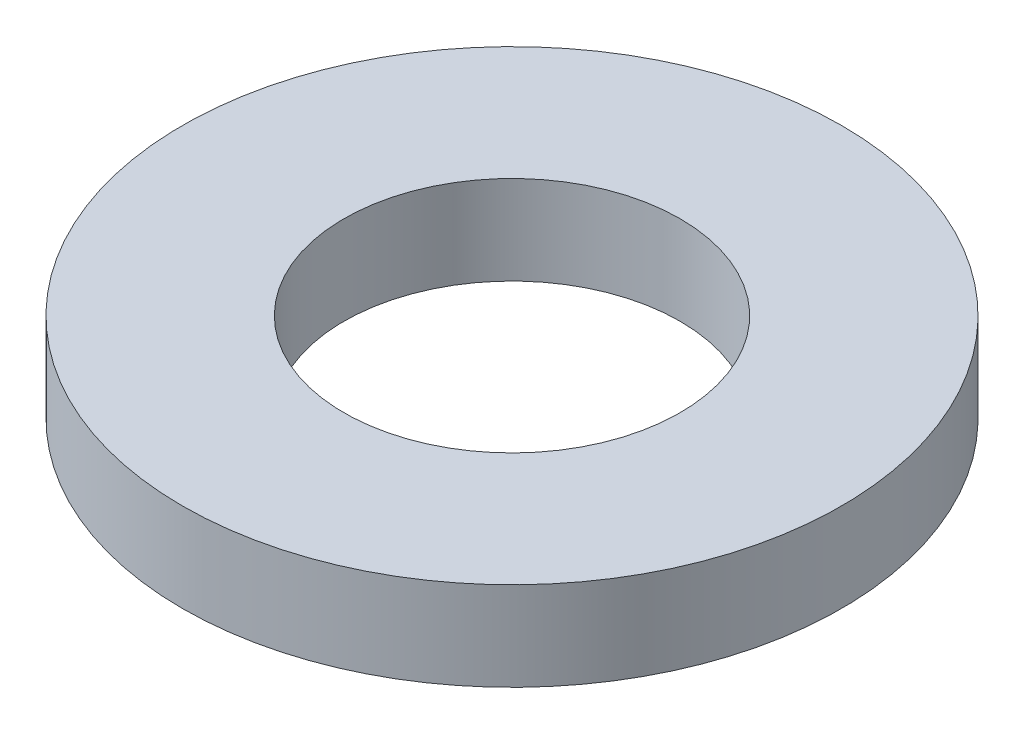
ISO-10303-21;
HEADER;
FILE_DESCRIPTION(('STEP AP214'),'2;1');
FILE_NAME('part.step','',(''),(''),'','','');
FILE_SCHEMA(('AUTOMOTIVE_DESIGN { 1 0 10303 214 1 1 1 1 }'));
ENDSEC;
DATA;
#1=APPLICATION_CONTEXT('core data for automotive mechanical design processes');
#2=APPLICATION_PROTOCOL_DEFINITION('international standard','automotive_design',2000,#1);
#3=PRODUCT_CONTEXT('',#1,'mechanical');
#4=PRODUCT('Part','Part','',(#3));
#5=PRODUCT_RELATED_PRODUCT_CATEGORY('part','',(#4));
#6=PRODUCT_DEFINITION_FORMATION('','',#4);
#7=PRODUCT_DEFINITION_CONTEXT('part definition',#1,'design');
#8=PRODUCT_DEFINITION('design','',#6,#7);
#9=PRODUCT_DEFINITION_SHAPE('','',#8);
#10=(LENGTH_UNIT() NAMED_UNIT(*) SI_UNIT(.MILLI.,.METRE.));
#11=(NAMED_UNIT(*) PLANE_ANGLE_UNIT() SI_UNIT($,.RADIAN.));
#12=(NAMED_UNIT(*) SI_UNIT($,.STERADIAN.) SOLID_ANGLE_UNIT());
#13=UNCERTAINTY_MEASURE_WITH_UNIT(LENGTH_MEASURE(1.E-05),#10,'distance_accuracy_value','');
#14=(GEOMETRIC_REPRESENTATION_CONTEXT(3) GLOBAL_UNCERTAINTY_ASSIGNED_CONTEXT((#13)) GLOBAL_UNIT_ASSIGNED_CONTEXT((#10,
#11,#12)) REPRESENTATION_CONTEXT('',''));
#15=CARTESIAN_POINT('',(0.,0.,0.));
#16=DIRECTION('',(0.,0.,1.));
#17=DIRECTION('',(1.,0.,0.));
#18=AXIS2_PLACEMENT_3D('',#15,#16,#17);
#19=CARTESIAN_POINT('',(3.48615,0.9398,0.));
#20=DIRECTION('',(0.,1.,0.));
#21=DIRECTION('',(0.,0.,1.));
#22=AXIS2_PLACEMENT_3D('',#19,#20,#21);
#23=PLANE('',#22);
#24=CARTESIAN_POINT('',(0.,0.9398,0.));
#25=DIRECTION('',(0.,-1.,0.));
#26=DIRECTION('',(0.,0.,-1.));
#27=AXIS2_PLACEMENT_3D('',#24,#25,#26);
#28=CIRCLE('',#27,1.778);
#29=CARTESIAN_POINT('',(0.,0.9398,-1.778));
#30=VERTEX_POINT('',#29);
#31=EDGE_CURVE('E10',#30,#30,#28,.T.);
#32=ORIENTED_EDGE('',*,*,#31,.T.);
#33=EDGE_LOOP('',(#32));
#34=FACE_BOUND('',#33,.T.);
#35=CARTESIAN_POINT('',(0.,0.9398,0.));
#36=DIRECTION('',(0.,-1.,0.));
#37=DIRECTION('',(0.,0.,-1.));
#38=AXIS2_PLACEMENT_3D('',#35,#36,#37);
#39=CIRCLE('',#38,3.48615);
#40=CARTESIAN_POINT('',(0.,0.9398,-3.48615));
#41=VERTEX_POINT('',#40);
#42=EDGE_CURVE('E45',#41,#41,#39,.T.);
#43=ORIENTED_EDGE('',*,*,#42,.F.);
#44=EDGE_LOOP('',(#43));
#45=FACE_BOUND('',#44,.T.);
#46=ADVANCED_FACE('F31',(#34,#45),#23,.T.);
#47=CARTESIAN_POINT('',(0.,0.9398,0.));
#48=DIRECTION('',(0.,-1.,0.));
#49=DIRECTION('',(0.,0.,-1.));
#50=AXIS2_PLACEMENT_3D('',#47,#48,#49);
#51=CYLINDRICAL_SURFACE('',#50,1.778);
#52=CARTESIAN_POINT('',(0.,0.,0.));
#53=DIRECTION('',(0.,-1.,0.));
#54=DIRECTION('',(0.,0.,-1.));
#55=AXIS2_PLACEMENT_3D('',#52,#53,#54);
#56=CIRCLE('',#55,1.778);
#57=CARTESIAN_POINT('',(0.,0.,-1.778));
#58=VERTEX_POINT('',#57);
#59=EDGE_CURVE('E37',#58,#58,#56,.T.);
#60=ORIENTED_EDGE('',*,*,#59,.T.);
#61=EDGE_LOOP('',(#60));
#62=FACE_BOUND('',#61,.T.);
#63=ORIENTED_EDGE('',*,*,#31,.F.);
#64=EDGE_LOOP('',(#63));
#65=FACE_BOUND('',#64,.T.);
#66=ADVANCED_FACE('F55',(#62,#65),#51,.F.);
#67=CARTESIAN_POINT('',(1.778,0.,0.));
#68=DIRECTION('',(0.,-1.,0.));
#69=DIRECTION('',(0.,0.,-1.));
#70=AXIS2_PLACEMENT_3D('',#67,#68,#69);
#71=PLANE('',#70);
#72=CARTESIAN_POINT('',(0.,0.,0.));
#73=DIRECTION('',(0.,-1.,0.));
#74=DIRECTION('',(0.,0.,-1.));
#75=AXIS2_PLACEMENT_3D('',#72,#73,#74);
#76=CIRCLE('',#75,3.48615);
#77=CARTESIAN_POINT('',(0.,0.,-3.48615));
#78=VERTEX_POINT('',#77);
#79=EDGE_CURVE('E41',#78,#78,#76,.T.);
#80=ORIENTED_EDGE('',*,*,#79,.T.);
#81=EDGE_LOOP('',(#80));
#82=FACE_BOUND('',#81,.T.);
#83=ORIENTED_EDGE('',*,*,#59,.F.);
#84=EDGE_LOOP('',(#83));
#85=FACE_BOUND('',#84,.T.);
#86=ADVANCED_FACE('F59',(#82,#85),#71,.T.);
#87=CARTESIAN_POINT('',(0.,0.9398,0.));
#88=DIRECTION('',(0.,-1.,0.));
#89=DIRECTION('',(0.,0.,-1.));
#90=AXIS2_PLACEMENT_3D('',#87,#88,#89);
#91=CYLINDRICAL_SURFACE('',#90,3.48615);
#92=ORIENTED_EDGE('',*,*,#42,.T.);
#93=EDGE_LOOP('',(#92));
#94=FACE_BOUND('',#93,.T.);
#95=ORIENTED_EDGE('',*,*,#79,.F.);
#96=EDGE_LOOP('',(#95));
#97=FACE_BOUND('',#96,.T.);
#98=ADVANCED_FACE('F51',(#94,#97),#91,.T.);
#99=CLOSED_SHELL('',(#46,#66,#86,#98));
#100=MANIFOLD_SOLID_BREP('B2',#99);
#101=ADVANCED_BREP_SHAPE_REPRESENTATION('',(#18,#100),#14);
#102=SHAPE_DEFINITION_REPRESENTATION(#9,#101);
ENDSEC;
END-ISO-10303-21;
